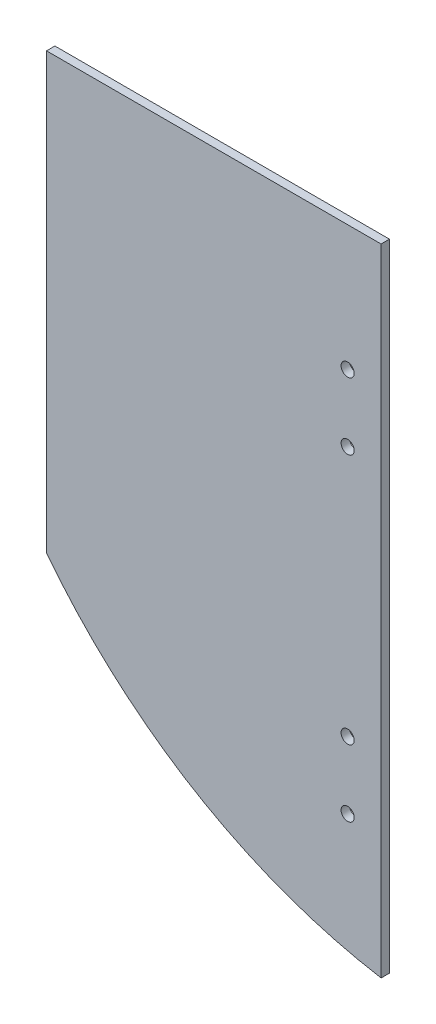
ISO-10303-21;
HEADER;
FILE_DESCRIPTION(('STEP AP214'),'2;1');
FILE_NAME('part.step','',(''),(''),'','','');
FILE_SCHEMA(('AUTOMOTIVE_DESIGN { 1 0 10303 214 1 1 1 1 }'));
ENDSEC;
DATA;
#1=APPLICATION_CONTEXT('core data for automotive mechanical design processes');
#2=APPLICATION_PROTOCOL_DEFINITION('international standard','automotive_design',2000,#1);
#3=PRODUCT_CONTEXT('',#1,'mechanical');
#4=PRODUCT('Part','Part','',(#3));
#5=PRODUCT_RELATED_PRODUCT_CATEGORY('part','',(#4));
#6=PRODUCT_DEFINITION_FORMATION('','',#4);
#7=PRODUCT_DEFINITION_CONTEXT('part definition',#1,'design');
#8=PRODUCT_DEFINITION('design','',#6,#7);
#9=PRODUCT_DEFINITION_SHAPE('','',#8);
#10=(LENGTH_UNIT() NAMED_UNIT(*) SI_UNIT(.MILLI.,.METRE.));
#11=(NAMED_UNIT(*) PLANE_ANGLE_UNIT() SI_UNIT($,.RADIAN.));
#12=(NAMED_UNIT(*) SI_UNIT($,.STERADIAN.) SOLID_ANGLE_UNIT());
#13=UNCERTAINTY_MEASURE_WITH_UNIT(LENGTH_MEASURE(1.E-05),#10,'distance_accuracy_value','');
#14=(GEOMETRIC_REPRESENTATION_CONTEXT(3) GLOBAL_UNCERTAINTY_ASSIGNED_CONTEXT((#13)) GLOBAL_UNIT_ASSIGNED_CONTEXT((#10,
#11,#12)) REPRESENTATION_CONTEXT('',''));
#15=CARTESIAN_POINT('',(0.,0.,0.));
#16=DIRECTION('',(0.,0.,1.));
#17=DIRECTION('',(1.,0.,0.));
#18=AXIS2_PLACEMENT_3D('',#15,#16,#17);
#19=CARTESIAN_POINT('',(63.5,120.65,3.175));
#20=DIRECTION('',(0.,-1.,0.));
#21=DIRECTION('',(0.,0.,-1.));
#22=AXIS2_PLACEMENT_3D('',#19,#20,#21);
#23=PLANE('',#22);
#24=DIRECTION('',(-1.,0.,0.));
#25=VECTOR('',#24,1.);
#26=CARTESIAN_POINT('',(63.5,120.65,0.));
#27=LINE('',#26,#25);
#28=CARTESIAN_POINT('',(63.5,120.65,0.));
#29=VERTEX_POINT('',#28);
#30=CARTESIAN_POINT('',(-63.5,120.65,0.));
#31=VERTEX_POINT('',#30);
#32=EDGE_CURVE('E97',#29,#31,#27,.T.);
#33=ORIENTED_EDGE('',*,*,#32,.T.);
#34=DIRECTION('',(0.,0.,-1.));
#35=VECTOR('',#34,1.);
#36=CARTESIAN_POINT('',(-63.5,120.65,3.175));
#37=LINE('',#36,#35);
#38=CARTESIAN_POINT('',(-63.5,120.65,3.175));
#39=VERTEX_POINT('',#38);
#40=EDGE_CURVE('E11',#39,#31,#37,.T.);
#41=ORIENTED_EDGE('',*,*,#40,.F.);
#42=DIRECTION('',(-1.,0.,0.));
#43=VECTOR('',#42,1.);
#44=CARTESIAN_POINT('',(63.5,120.65,3.175));
#45=LINE('',#44,#43);
#46=CARTESIAN_POINT('',(63.5,120.65,3.175));
#47=VERTEX_POINT('',#46);
#48=EDGE_CURVE('E91',#47,#39,#45,.T.);
#49=ORIENTED_EDGE('',*,*,#48,.F.);
#50=DIRECTION('',(0.,0.,-1.));
#51=VECTOR('',#50,1.);
#52=CARTESIAN_POINT('',(63.5,120.65,3.175));
#53=LINE('',#52,#51);
#54=EDGE_CURVE('E85',#47,#29,#53,.T.);
#55=ORIENTED_EDGE('',*,*,#54,.T.);
#56=EDGE_LOOP('',(#33,#41,#49,#55));
#57=FACE_BOUND('',#56,.T.);
#58=ADVANCED_FACE('F44',(#57),#23,.F.);
#59=CARTESIAN_POINT('',(-63.5,-120.65,3.175));
#60=DIRECTION('',(1.,0.,0.));
#61=DIRECTION('',(0.,0.,-1.));
#62=AXIS2_PLACEMENT_3D('',#59,#60,#61);
#63=PLANE('',#62);
#64=DIRECTION('',(0.,-1.,0.));
#65=VECTOR('',#64,1.);
#66=CARTESIAN_POINT('',(-63.5,-120.65,0.));
#67=LINE('',#66,#65);
#68=CARTESIAN_POINT('',(-63.5,-44.45,0.));
#69=VERTEX_POINT('',#68);
#70=EDGE_CURVE('E92',#31,#69,#67,.T.);
#71=ORIENTED_EDGE('',*,*,#70,.T.);
#72=DIRECTION('',(0.,0.,1.));
#73=VECTOR('',#72,1.);
#74=CARTESIAN_POINT('',(-63.5,-44.45,0.));
#75=LINE('',#74,#73);
#76=CARTESIAN_POINT('',(-63.5,-44.45,3.175));
#77=VERTEX_POINT('',#76);
#78=EDGE_CURVE('E59',#69,#77,#75,.T.);
#79=ORIENTED_EDGE('',*,*,#78,.T.);
#80=DIRECTION('',(0.,-1.,0.));
#81=VECTOR('',#80,1.);
#82=CARTESIAN_POINT('',(-63.5,-120.65,3.175));
#83=LINE('',#82,#81);
#84=EDGE_CURVE('E117',#39,#77,#83,.T.);
#85=ORIENTED_EDGE('',*,*,#84,.F.);
#86=ORIENTED_EDGE('',*,*,#40,.T.);
#87=EDGE_LOOP('',(#71,#79,#85,#86));
#88=FACE_BOUND('',#87,.T.);
#89=ADVANCED_FACE('F157',(#88),#63,.F.);
#90=CARTESIAN_POINT('',(63.5,-120.65,3.175));
#91=DIRECTION('',(-1.,0.,0.));
#92=DIRECTION('',(0.,0.,1.));
#93=AXIS2_PLACEMENT_3D('',#90,#91,#92);
#94=PLANE('',#93);
#95=DIRECTION('',(0.,1.,0.));
#96=VECTOR('',#95,1.);
#97=CARTESIAN_POINT('',(63.5,-120.65,0.));
#98=LINE('',#97,#96);
#99=CARTESIAN_POINT('',(63.5,-120.65,0.));
#100=VERTEX_POINT('',#99);
#101=EDGE_CURVE('E82',#100,#29,#98,.T.);
#102=ORIENTED_EDGE('',*,*,#101,.T.);
#103=ORIENTED_EDGE('',*,*,#54,.F.);
#104=DIRECTION('',(0.,1.,0.));
#105=VECTOR('',#104,1.);
#106=CARTESIAN_POINT('',(63.5,-120.65,3.175));
#107=LINE('',#106,#105);
#108=CARTESIAN_POINT('',(63.5,-120.65,3.175));
#109=VERTEX_POINT('',#108);
#110=EDGE_CURVE('E68',#109,#47,#107,.T.);
#111=ORIENTED_EDGE('',*,*,#110,.F.);
#112=DIRECTION('',(0.,0.,-1.));
#113=VECTOR('',#112,1.);
#114=CARTESIAN_POINT('',(63.5,-120.65,3.175));
#115=LINE('',#114,#113);
#116=EDGE_CURVE('E52',#109,#100,#115,.T.);
#117=ORIENTED_EDGE('',*,*,#116,.T.);
#118=EDGE_LOOP('',(#102,#103,#111,#117));
#119=FACE_BOUND('',#118,.T.);
#120=ADVANCED_FACE('F84',(#119),#94,.F.);
#121=CARTESIAN_POINT('',(0.,0.,3.175));
#122=DIRECTION('',(0.,0.,-1.));
#123=DIRECTION('',(-1.,0.,0.));
#124=AXIS2_PLACEMENT_3D('',#121,#122,#123);
#125=PLANE('',#124);
#126=CARTESIAN_POINT('',(50.8,-73.025,3.175));
#127=DIRECTION('',(0.,0.,1.));
#128=DIRECTION('',(1.,0.,0.));
#129=AXIS2_PLACEMENT_3D('',#126,#127,#128);
#130=CIRCLE('',#129,2.48919999999999);
#131=CARTESIAN_POINT('',(53.2892,-73.025,3.175));
#132=VERTEX_POINT('',#131);
#133=EDGE_CURVE('E145',#132,#132,#130,.T.);
#134=ORIENTED_EDGE('',*,*,#133,.F.);
#135=EDGE_LOOP('',(#134));
#136=FACE_BOUND('',#135,.T.);
#137=CARTESIAN_POINT('',(50.8,-47.625,3.175));
#138=DIRECTION('',(0.,0.,1.));
#139=DIRECTION('',(1.,0.,0.));
#140=AXIS2_PLACEMENT_3D('',#137,#138,#139);
#141=CIRCLE('',#140,2.48919999999999);
#142=CARTESIAN_POINT('',(53.2892,-47.625,3.175));
#143=VERTEX_POINT('',#142);
#144=EDGE_CURVE('E137',#143,#143,#141,.T.);
#145=ORIENTED_EDGE('',*,*,#144,.F.);
#146=EDGE_LOOP('',(#145));
#147=FACE_BOUND('',#146,.T.);
#148=CARTESIAN_POINT('',(50.8,47.625,3.175));
#149=DIRECTION('',(0.,0.,1.));
#150=DIRECTION('',(1.,0.,0.));
#151=AXIS2_PLACEMENT_3D('',#148,#149,#150);
#152=CIRCLE('',#151,2.48919999999999);
#153=CARTESIAN_POINT('',(53.2892,47.625,3.175));
#154=VERTEX_POINT('',#153);
#155=EDGE_CURVE('E129',#154,#154,#152,.T.);
#156=ORIENTED_EDGE('',*,*,#155,.F.);
#157=EDGE_LOOP('',(#156));
#158=FACE_BOUND('',#157,.T.);
#159=CARTESIAN_POINT('',(50.8,73.025,3.175));
#160=DIRECTION('',(0.,0.,1.));
#161=DIRECTION('',(1.,0.,0.));
#162=AXIS2_PLACEMENT_3D('',#159,#160,#161);
#163=CIRCLE('',#162,2.48919999999999);
#164=CARTESIAN_POINT('',(53.2892,73.025,3.175));
#165=VERTEX_POINT('',#164);
#166=EDGE_CURVE('E110',#165,#165,#163,.T.);
#167=ORIENTED_EDGE('',*,*,#166,.F.);
#168=EDGE_LOOP('',(#167));
#169=FACE_BOUND('',#168,.T.);
#170=ORIENTED_EDGE('',*,*,#84,.T.);
#171=CARTESIAN_POINT('',(97.3558391251635,79.7097318752724,3.175));
#172=DIRECTION('',(0.,0.,-1.));
#173=DIRECTION('',(1.,0.,0.));
#174=AXIS2_PLACEMENT_3D('',#171,#172,#173);
#175=CIRCLE('',#174,203.2);
#176=EDGE_CURVE('E152',#109,#77,#175,.T.);
#177=ORIENTED_EDGE('',*,*,#176,.F.);
#178=ORIENTED_EDGE('',*,*,#110,.T.);
#179=ORIENTED_EDGE('',*,*,#48,.T.);
#180=EDGE_LOOP('',(#170,#177,#178,#179));
#181=FACE_BOUND('',#180,.T.);
#182=ADVANCED_FACE('F159',(#136,#147,#158,#169,#181),#125,.F.);
#183=CARTESIAN_POINT('',(0.,0.,0.));
#184=DIRECTION('',(0.,0.,-1.));
#185=DIRECTION('',(-1.,0.,0.));
#186=AXIS2_PLACEMENT_3D('',#183,#184,#185);
#187=PLANE('',#186);
#188=CARTESIAN_POINT('',(97.3558391251635,79.7097318752724,0.));
#189=DIRECTION('',(0.,0.,-1.));
#190=DIRECTION('',(1.,0.,0.));
#191=AXIS2_PLACEMENT_3D('',#188,#189,#190);
#192=CIRCLE('',#191,203.2);
#193=EDGE_CURVE('E151',#100,#69,#192,.T.);
#194=ORIENTED_EDGE('',*,*,#193,.T.);
#195=ORIENTED_EDGE('',*,*,#70,.F.);
#196=ORIENTED_EDGE('',*,*,#32,.F.);
#197=ORIENTED_EDGE('',*,*,#101,.F.);
#198=EDGE_LOOP('',(#194,#195,#196,#197));
#199=FACE_BOUND('',#198,.T.);
#200=CARTESIAN_POINT('',(50.8,-73.025,0.));
#201=DIRECTION('',(0.,0.,1.));
#202=DIRECTION('',(1.,0.,0.));
#203=AXIS2_PLACEMENT_3D('',#200,#201,#202);
#204=CIRCLE('',#203,2.4892);
#205=CARTESIAN_POINT('',(53.2892,-73.025,0.));
#206=VERTEX_POINT('',#205);
#207=EDGE_CURVE('E141',#206,#206,#204,.T.);
#208=ORIENTED_EDGE('',*,*,#207,.T.);
#209=EDGE_LOOP('',(#208));
#210=FACE_BOUND('',#209,.T.);
#211=CARTESIAN_POINT('',(50.8,-47.625,0.));
#212=DIRECTION('',(0.,0.,1.));
#213=DIRECTION('',(1.,0.,0.));
#214=AXIS2_PLACEMENT_3D('',#211,#212,#213);
#215=CIRCLE('',#214,2.4892);
#216=CARTESIAN_POINT('',(53.2892,-47.625,0.));
#217=VERTEX_POINT('',#216);
#218=EDGE_CURVE('E133',#217,#217,#215,.T.);
#219=ORIENTED_EDGE('',*,*,#218,.T.);
#220=EDGE_LOOP('',(#219));
#221=FACE_BOUND('',#220,.T.);
#222=CARTESIAN_POINT('',(50.8,47.625,0.));
#223=DIRECTION('',(0.,0.,1.));
#224=DIRECTION('',(1.,0.,0.));
#225=AXIS2_PLACEMENT_3D('',#222,#223,#224);
#226=CIRCLE('',#225,2.4892);
#227=CARTESIAN_POINT('',(53.2892,47.625,0.));
#228=VERTEX_POINT('',#227);
#229=EDGE_CURVE('E125',#228,#228,#226,.T.);
#230=ORIENTED_EDGE('',*,*,#229,.T.);
#231=EDGE_LOOP('',(#230));
#232=FACE_BOUND('',#231,.T.);
#233=CARTESIAN_POINT('',(50.8,73.025,0.));
#234=DIRECTION('',(0.,0.,1.));
#235=DIRECTION('',(1.,0.,0.));
#236=AXIS2_PLACEMENT_3D('',#233,#234,#235);
#237=CIRCLE('',#236,2.4892);
#238=CARTESIAN_POINT('',(53.2892,73.025,0.));
#239=VERTEX_POINT('',#238);
#240=EDGE_CURVE('E104',#239,#239,#237,.T.);
#241=ORIENTED_EDGE('',*,*,#240,.T.);
#242=EDGE_LOOP('',(#241));
#243=FACE_BOUND('',#242,.T.);
#244=ADVANCED_FACE('F100',(#199,#210,#221,#232,#243),#187,.T.);
#245=CARTESIAN_POINT('',(50.8,73.025,3.175));
#246=DIRECTION('',(0.,0.,1.));
#247=DIRECTION('',(1.,0.,0.));
#248=AXIS2_PLACEMENT_3D('',#245,#246,#247);
#249=CYLINDRICAL_SURFACE('',#248,2.48919999999999);
#250=ORIENTED_EDGE('',*,*,#240,.F.);
#251=EDGE_LOOP('',(#250));
#252=FACE_BOUND('',#251,.T.);
#253=ORIENTED_EDGE('',*,*,#166,.T.);
#254=EDGE_LOOP('',(#253));
#255=FACE_BOUND('',#254,.T.);
#256=ADVANCED_FACE('F185',(#252,#255),#249,.F.);
#257=CARTESIAN_POINT('',(50.8,47.625,3.175));
#258=DIRECTION('',(0.,0.,1.));
#259=DIRECTION('',(1.,0.,0.));
#260=AXIS2_PLACEMENT_3D('',#257,#258,#259);
#261=CYLINDRICAL_SURFACE('',#260,2.48919999999999);
#262=ORIENTED_EDGE('',*,*,#229,.F.);
#263=EDGE_LOOP('',(#262));
#264=FACE_BOUND('',#263,.T.);
#265=ORIENTED_EDGE('',*,*,#155,.T.);
#266=EDGE_LOOP('',(#265));
#267=FACE_BOUND('',#266,.T.);
#268=ADVANCED_FACE('F190',(#264,#267),#261,.F.);
#269=CARTESIAN_POINT('',(50.8,-47.625,3.175));
#270=DIRECTION('',(0.,0.,1.));
#271=DIRECTION('',(1.,0.,0.));
#272=AXIS2_PLACEMENT_3D('',#269,#270,#271);
#273=CYLINDRICAL_SURFACE('',#272,2.48919999999999);
#274=ORIENTED_EDGE('',*,*,#218,.F.);
#275=EDGE_LOOP('',(#274));
#276=FACE_BOUND('',#275,.T.);
#277=ORIENTED_EDGE('',*,*,#144,.T.);
#278=EDGE_LOOP('',(#277));
#279=FACE_BOUND('',#278,.T.);
#280=ADVANCED_FACE('F171',(#276,#279),#273,.F.);
#281=CARTESIAN_POINT('',(50.8,-73.025,3.175));
#282=DIRECTION('',(0.,0.,1.));
#283=DIRECTION('',(1.,0.,0.));
#284=AXIS2_PLACEMENT_3D('',#281,#282,#283);
#285=CYLINDRICAL_SURFACE('',#284,2.48919999999999);
#286=ORIENTED_EDGE('',*,*,#207,.F.);
#287=EDGE_LOOP('',(#286));
#288=FACE_BOUND('',#287,.T.);
#289=ORIENTED_EDGE('',*,*,#133,.T.);
#290=EDGE_LOOP('',(#289));
#291=FACE_BOUND('',#290,.T.);
#292=ADVANCED_FACE('F165',(#288,#291),#285,.F.);
#293=CARTESIAN_POINT('',(97.3558391251635,79.7097318752724,0.));
#294=DIRECTION('',(0.,0.,1.));
#295=DIRECTION('',(1.,0.,0.));
#296=AXIS2_PLACEMENT_3D('',#293,#294,#295);
#297=CYLINDRICAL_SURFACE('',#296,203.2);
#298=ORIENTED_EDGE('',*,*,#176,.T.);
#299=ORIENTED_EDGE('',*,*,#78,.F.);
#300=ORIENTED_EDGE('',*,*,#193,.F.);
#301=ORIENTED_EDGE('',*,*,#116,.F.);
#302=EDGE_LOOP('',(#298,#299,#300,#301));
#303=FACE_BOUND('',#302,.T.);
#304=ADVANCED_FACE('F163',(#303),#297,.T.);
#305=CLOSED_SHELL('',(#58,#89,#120,#182,#244,#256,#268,#280,#292,#304));
#306=MANIFOLD_SOLID_BREP('B2',#305);
#307=ADVANCED_BREP_SHAPE_REPRESENTATION('',(#18,#306),#14);
#308=SHAPE_DEFINITION_REPRESENTATION(#9,#307);
ENDSEC;
END-ISO-10303-21;
